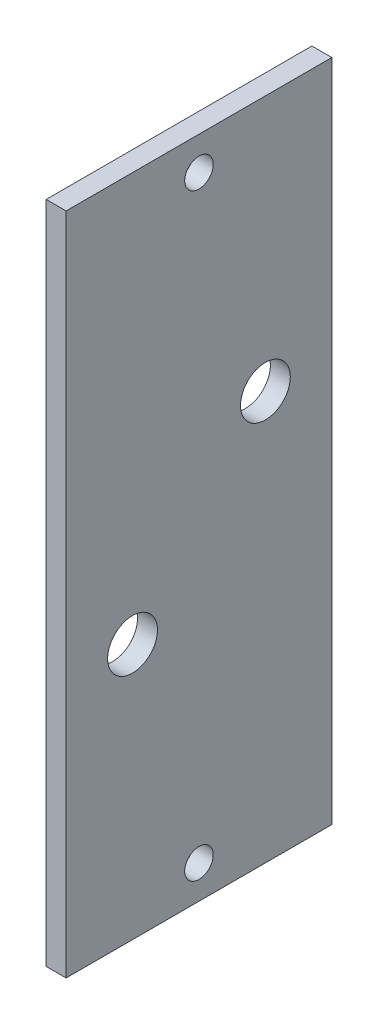
ISO-10303-21;
HEADER;
FILE_DESCRIPTION(('STEP AP214'),'2;1');
FILE_NAME('part.step','',(''),(''),'','','');
FILE_SCHEMA(('AUTOMOTIVE_DESIGN { 1 0 10303 214 1 1 1 1 }'));
ENDSEC;
DATA;
#1=APPLICATION_CONTEXT('core data for automotive mechanical design processes');
#2=APPLICATION_PROTOCOL_DEFINITION('international standard','automotive_design',2000,#1);
#3=PRODUCT_CONTEXT('',#1,'mechanical');
#4=PRODUCT('Part','Part','',(#3));
#5=PRODUCT_RELATED_PRODUCT_CATEGORY('part','',(#4));
#6=PRODUCT_DEFINITION_FORMATION('','',#4);
#7=PRODUCT_DEFINITION_CONTEXT('part definition',#1,'design');
#8=PRODUCT_DEFINITION('design','',#6,#7);
#9=PRODUCT_DEFINITION_SHAPE('','',#8);
#10=(LENGTH_UNIT() NAMED_UNIT(*) SI_UNIT(.MILLI.,.METRE.));
#11=(NAMED_UNIT(*) PLANE_ANGLE_UNIT() SI_UNIT($,.RADIAN.));
#12=(NAMED_UNIT(*) SI_UNIT($,.STERADIAN.) SOLID_ANGLE_UNIT());
#13=UNCERTAINTY_MEASURE_WITH_UNIT(LENGTH_MEASURE(1.E-05),#10,'distance_accuracy_value','');
#14=(GEOMETRIC_REPRESENTATION_CONTEXT(3) GLOBAL_UNCERTAINTY_ASSIGNED_CONTEXT((#13)) GLOBAL_UNIT_ASSIGNED_CONTEXT((#10,
#11,#12)) REPRESENTATION_CONTEXT('',''));
#15=CARTESIAN_POINT('',(0.,0.,0.));
#16=DIRECTION('',(0.,0.,1.));
#17=DIRECTION('',(1.,0.,0.));
#18=AXIS2_PLACEMENT_3D('',#15,#16,#17);
#19=CARTESIAN_POINT('',(3.,0.,0.));
#20=DIRECTION('',(-1.,0.,0.));
#21=DIRECTION('',(0.,0.,1.));
#22=AXIS2_PLACEMENT_3D('',#19,#20,#21);
#23=PLANE('',#22);
#24=DIRECTION('',(0.,-1.,0.));
#25=VECTOR('',#24,1.);
#26=CARTESIAN_POINT('',(3.,0.,0.));
#27=LINE('',#26,#25);
#28=CARTESIAN_POINT('',(3.,100.,0.));
#29=VERTEX_POINT('',#28);
#30=CARTESIAN_POINT('',(3.,0.,0.));
#31=VERTEX_POINT('',#30);
#32=EDGE_CURVE('E96',#29,#31,#27,.T.);
#33=ORIENTED_EDGE('',*,*,#32,.T.);
#34=DIRECTION('',(0.,0.,-1.));
#35=VECTOR('',#34,1.);
#36=CARTESIAN_POINT('',(3.,0.,0.));
#37=LINE('',#36,#35);
#38=CARTESIAN_POINT('',(3.,0.,-40.));
#39=VERTEX_POINT('',#38);
#40=EDGE_CURVE('E91',#31,#39,#37,.T.);
#41=ORIENTED_EDGE('',*,*,#40,.T.);
#42=DIRECTION('',(0.,1.,0.));
#43=VECTOR('',#42,1.);
#44=CARTESIAN_POINT('',(3.,0.,-40.));
#45=LINE('',#44,#43);
#46=CARTESIAN_POINT('',(3.,100.,-40.));
#47=VERTEX_POINT('',#46);
#48=EDGE_CURVE('E94',#39,#47,#45,.T.);
#49=ORIENTED_EDGE('',*,*,#48,.T.);
#50=DIRECTION('',(0.,0.,1.));
#51=VECTOR('',#50,1.);
#52=CARTESIAN_POINT('',(3.,100.,0.));
#53=LINE('',#52,#51);
#54=EDGE_CURVE('E61',#47,#29,#53,.T.);
#55=ORIENTED_EDGE('',*,*,#54,.T.);
#56=EDGE_LOOP('',(#33,#41,#49,#55));
#57=FACE_BOUND('',#56,.T.);
#58=CARTESIAN_POINT('',(3.,95.,-20.));
#59=DIRECTION('',(1.,0.,0.));
#60=DIRECTION('',(0.,0.,-1.));
#61=AXIS2_PLACEMENT_3D('',#58,#59,#60);
#62=CIRCLE('',#61,2.15);
#63=CARTESIAN_POINT('',(3.,95.,-22.15));
#64=VERTEX_POINT('',#63);
#65=EDGE_CURVE('E116',#64,#64,#62,.T.);
#66=ORIENTED_EDGE('',*,*,#65,.F.);
#67=EDGE_LOOP('',(#66));
#68=FACE_BOUND('',#67,.T.);
#69=CARTESIAN_POINT('',(3.,5.,-20.));
#70=DIRECTION('',(1.,0.,0.));
#71=DIRECTION('',(0.,0.,-1.));
#72=AXIS2_PLACEMENT_3D('',#69,#70,#71);
#73=CIRCLE('',#72,2.15);
#74=CARTESIAN_POINT('',(3.,5.,-22.15));
#75=VERTEX_POINT('',#74);
#76=EDGE_CURVE('E138',#75,#75,#73,.T.);
#77=ORIENTED_EDGE('',*,*,#76,.F.);
#78=EDGE_LOOP('',(#77));
#79=FACE_BOUND('',#78,.T.);
#80=CARTESIAN_POINT('',(3.,38.5,-10.));
#81=DIRECTION('',(1.,0.,0.));
#82=DIRECTION('',(0.,0.,-1.));
#83=AXIS2_PLACEMENT_3D('',#80,#81,#82);
#84=CIRCLE('',#83,3.75);
#85=CARTESIAN_POINT('',(3.,38.5,-13.75));
#86=VERTEX_POINT('',#85);
#87=EDGE_CURVE('E146',#86,#86,#84,.T.);
#88=ORIENTED_EDGE('',*,*,#87,.F.);
#89=EDGE_LOOP('',(#88));
#90=FACE_BOUND('',#89,.T.);
#91=CARTESIAN_POINT('',(3.,61.5,-30.));
#92=DIRECTION('',(1.,0.,0.));
#93=DIRECTION('',(0.,0.,-1.));
#94=AXIS2_PLACEMENT_3D('',#91,#92,#93);
#95=CIRCLE('',#94,3.75000000000001);
#96=CARTESIAN_POINT('',(3.,61.5,-33.75));
#97=VERTEX_POINT('',#96);
#98=EDGE_CURVE('E154',#97,#97,#95,.T.);
#99=ORIENTED_EDGE('',*,*,#98,.F.);
#100=EDGE_LOOP('',(#99));
#101=FACE_BOUND('',#100,.T.);
#102=ADVANCED_FACE('F43',(#57,#68,#79,#90,#101),#23,.F.);
#103=CARTESIAN_POINT('',(0.,0.,0.));
#104=DIRECTION('',(-1.,0.,0.));
#105=DIRECTION('',(0.,0.,1.));
#106=AXIS2_PLACEMENT_3D('',#103,#104,#105);
#107=PLANE('',#106);
#108=CARTESIAN_POINT('',(0.,38.5,-10.));
#109=DIRECTION('',(1.,0.,0.));
#110=DIRECTION('',(0.,0.,-1.));
#111=AXIS2_PLACEMENT_3D('',#108,#109,#110);
#112=CIRCLE('',#111,3.75);
#113=CARTESIAN_POINT('',(0.,38.5,-13.75));
#114=VERTEX_POINT('',#113);
#115=EDGE_CURVE('E150',#114,#114,#112,.T.);
#116=ORIENTED_EDGE('',*,*,#115,.T.);
#117=EDGE_LOOP('',(#116));
#118=FACE_BOUND('',#117,.T.);
#119=CARTESIAN_POINT('',(0.,95.,-20.));
#120=DIRECTION('',(1.,0.,0.));
#121=DIRECTION('',(0.,0.,-1.));
#122=AXIS2_PLACEMENT_3D('',#119,#120,#121);
#123=CIRCLE('',#122,2.15);
#124=CARTESIAN_POINT('',(0.,95.,-22.15));
#125=VERTEX_POINT('',#124);
#126=EDGE_CURVE('E134',#125,#125,#123,.T.);
#127=ORIENTED_EDGE('',*,*,#126,.T.);
#128=EDGE_LOOP('',(#127));
#129=FACE_BOUND('',#128,.T.);
#130=DIRECTION('',(0.,-1.,0.));
#131=VECTOR('',#130,1.);
#132=CARTESIAN_POINT('',(0.,0.,0.));
#133=LINE('',#132,#131);
#134=CARTESIAN_POINT('',(0.,100.,0.));
#135=VERTEX_POINT('',#134);
#136=CARTESIAN_POINT('',(0.,0.,0.));
#137=VERTEX_POINT('',#136);
#138=EDGE_CURVE('E112',#135,#137,#133,.T.);
#139=ORIENTED_EDGE('',*,*,#138,.F.);
#140=DIRECTION('',(0.,0.,1.));
#141=VECTOR('',#140,1.);
#142=CARTESIAN_POINT('',(0.,100.,0.));
#143=LINE('',#142,#141);
#144=CARTESIAN_POINT('',(0.,100.,-40.));
#145=VERTEX_POINT('',#144);
#146=EDGE_CURVE('E84',#145,#135,#143,.T.);
#147=ORIENTED_EDGE('',*,*,#146,.F.);
#148=DIRECTION('',(0.,1.,0.));
#149=VECTOR('',#148,1.);
#150=CARTESIAN_POINT('',(0.,0.,-40.));
#151=LINE('',#150,#149);
#152=CARTESIAN_POINT('',(0.,0.,-40.));
#153=VERTEX_POINT('',#152);
#154=EDGE_CURVE('E78',#153,#145,#151,.T.);
#155=ORIENTED_EDGE('',*,*,#154,.F.);
#156=DIRECTION('',(0.,0.,-1.));
#157=VECTOR('',#156,1.);
#158=CARTESIAN_POINT('',(0.,0.,0.));
#159=LINE('',#158,#157);
#160=EDGE_CURVE('E101',#137,#153,#159,.T.);
#161=ORIENTED_EDGE('',*,*,#160,.F.);
#162=EDGE_LOOP('',(#139,#147,#155,#161));
#163=FACE_BOUND('',#162,.T.);
#164=CARTESIAN_POINT('',(0.,5.,-20.));
#165=DIRECTION('',(1.,0.,0.));
#166=DIRECTION('',(0.,0.,-1.));
#167=AXIS2_PLACEMENT_3D('',#164,#165,#166);
#168=CIRCLE('',#167,2.15);
#169=CARTESIAN_POINT('',(0.,5.,-22.15));
#170=VERTEX_POINT('',#169);
#171=EDGE_CURVE('E142',#170,#170,#168,.T.);
#172=ORIENTED_EDGE('',*,*,#171,.T.);
#173=EDGE_LOOP('',(#172));
#174=FACE_BOUND('',#173,.T.);
#175=CARTESIAN_POINT('',(0.,61.5,-30.));
#176=DIRECTION('',(1.,0.,0.));
#177=DIRECTION('',(0.,0.,-1.));
#178=AXIS2_PLACEMENT_3D('',#175,#176,#177);
#179=CIRCLE('',#178,3.75000000000001);
#180=CARTESIAN_POINT('',(0.,61.5,-33.75));
#181=VERTEX_POINT('',#180);
#182=EDGE_CURVE('E158',#181,#181,#179,.T.);
#183=ORIENTED_EDGE('',*,*,#182,.T.);
#184=EDGE_LOOP('',(#183));
#185=FACE_BOUND('',#184,.T.);
#186=ADVANCED_FACE('F129',(#118,#129,#163,#174,#185),#107,.T.);
#187=CARTESIAN_POINT('',(3.,0.,0.));
#188=DIRECTION('',(0.,0.,-1.));
#189=DIRECTION('',(-1.,0.,0.));
#190=AXIS2_PLACEMENT_3D('',#187,#188,#189);
#191=PLANE('',#190);
#192=ORIENTED_EDGE('',*,*,#138,.T.);
#193=DIRECTION('',(-1.,0.,0.));
#194=VECTOR('',#193,1.);
#195=CARTESIAN_POINT('',(3.,0.,0.));
#196=LINE('',#195,#194);
#197=EDGE_CURVE('E11',#31,#137,#196,.T.);
#198=ORIENTED_EDGE('',*,*,#197,.F.);
#199=ORIENTED_EDGE('',*,*,#32,.F.);
#200=DIRECTION('',(-1.,0.,0.));
#201=VECTOR('',#200,1.);
#202=CARTESIAN_POINT('',(3.,100.,0.));
#203=LINE('',#202,#201);
#204=EDGE_CURVE('E108',#29,#135,#203,.T.);
#205=ORIENTED_EDGE('',*,*,#204,.T.);
#206=EDGE_LOOP('',(#192,#198,#199,#205));
#207=FACE_BOUND('',#206,.T.);
#208=ADVANCED_FACE('F45',(#207),#191,.F.);
#209=CARTESIAN_POINT('',(3.,0.,0.));
#210=DIRECTION('',(0.,1.,0.));
#211=DIRECTION('',(0.,0.,1.));
#212=AXIS2_PLACEMENT_3D('',#209,#210,#211);
#213=PLANE('',#212);
#214=ORIENTED_EDGE('',*,*,#160,.T.);
#215=DIRECTION('',(-1.,0.,0.));
#216=VECTOR('',#215,1.);
#217=CARTESIAN_POINT('',(3.,0.,-40.));
#218=LINE('',#217,#216);
#219=EDGE_CURVE('E53',#39,#153,#218,.T.);
#220=ORIENTED_EDGE('',*,*,#219,.F.);
#221=ORIENTED_EDGE('',*,*,#40,.F.);
#222=ORIENTED_EDGE('',*,*,#197,.T.);
#223=EDGE_LOOP('',(#214,#220,#221,#222));
#224=FACE_BOUND('',#223,.T.);
#225=ADVANCED_FACE('F100',(#224),#213,.F.);
#226=CARTESIAN_POINT('',(3.,0.,-40.));
#227=DIRECTION('',(0.,0.,1.));
#228=DIRECTION('',(1.,0.,0.));
#229=AXIS2_PLACEMENT_3D('',#226,#227,#228);
#230=PLANE('',#229);
#231=ORIENTED_EDGE('',*,*,#154,.T.);
#232=DIRECTION('',(-1.,0.,0.));
#233=VECTOR('',#232,1.);
#234=CARTESIAN_POINT('',(3.,100.,-40.));
#235=LINE('',#234,#233);
#236=EDGE_CURVE('E103',#47,#145,#235,.T.);
#237=ORIENTED_EDGE('',*,*,#236,.F.);
#238=ORIENTED_EDGE('',*,*,#48,.F.);
#239=ORIENTED_EDGE('',*,*,#219,.T.);
#240=EDGE_LOOP('',(#231,#237,#238,#239));
#241=FACE_BOUND('',#240,.T.);
#242=ADVANCED_FACE('F104',(#241),#230,.F.);
#243=CARTESIAN_POINT('',(3.,100.,0.));
#244=DIRECTION('',(0.,-1.,0.));
#245=DIRECTION('',(0.,0.,-1.));
#246=AXIS2_PLACEMENT_3D('',#243,#244,#245);
#247=PLANE('',#246);
#248=ORIENTED_EDGE('',*,*,#146,.T.);
#249=ORIENTED_EDGE('',*,*,#204,.F.);
#250=ORIENTED_EDGE('',*,*,#54,.F.);
#251=ORIENTED_EDGE('',*,*,#236,.T.);
#252=EDGE_LOOP('',(#248,#249,#250,#251));
#253=FACE_BOUND('',#252,.T.);
#254=ADVANCED_FACE('F126',(#253),#247,.F.);
#255=CARTESIAN_POINT('',(3.,95.,-20.));
#256=DIRECTION('',(-1.,0.,0.));
#257=DIRECTION('',(0.,0.,1.));
#258=AXIS2_PLACEMENT_3D('',#255,#256,#257);
#259=CYLINDRICAL_SURFACE('',#258,2.15);
#260=ORIENTED_EDGE('',*,*,#65,.T.);
#261=EDGE_LOOP('',(#260));
#262=FACE_BOUND('',#261,.T.);
#263=ORIENTED_EDGE('',*,*,#126,.F.);
#264=EDGE_LOOP('',(#263));
#265=FACE_BOUND('',#264,.T.);
#266=ADVANCED_FACE('F177',(#262,#265),#259,.F.);
#267=CARTESIAN_POINT('',(3.,5.,-20.));
#268=DIRECTION('',(-1.,0.,0.));
#269=DIRECTION('',(0.,0.,1.));
#270=AXIS2_PLACEMENT_3D('',#267,#268,#269);
#271=CYLINDRICAL_SURFACE('',#270,2.15);
#272=ORIENTED_EDGE('',*,*,#76,.T.);
#273=EDGE_LOOP('',(#272));
#274=FACE_BOUND('',#273,.T.);
#275=ORIENTED_EDGE('',*,*,#171,.F.);
#276=EDGE_LOOP('',(#275));
#277=FACE_BOUND('',#276,.T.);
#278=ADVANCED_FACE('F231',(#274,#277),#271,.F.);
#279=CARTESIAN_POINT('',(3.,38.5,-10.));
#280=DIRECTION('',(-1.,0.,0.));
#281=DIRECTION('',(0.,0.,1.));
#282=AXIS2_PLACEMENT_3D('',#279,#280,#281);
#283=CYLINDRICAL_SURFACE('',#282,3.75);
#284=ORIENTED_EDGE('',*,*,#87,.T.);
#285=EDGE_LOOP('',(#284));
#286=FACE_BOUND('',#285,.T.);
#287=ORIENTED_EDGE('',*,*,#115,.F.);
#288=EDGE_LOOP('',(#287));
#289=FACE_BOUND('',#288,.T.);
#290=ADVANCED_FACE('F240',(#286,#289),#283,.F.);
#291=CARTESIAN_POINT('',(3.,61.5,-30.));
#292=DIRECTION('',(-1.,0.,0.));
#293=DIRECTION('',(0.,0.,1.));
#294=AXIS2_PLACEMENT_3D('',#291,#292,#293);
#295=CYLINDRICAL_SURFACE('',#294,3.75000000000001);
#296=ORIENTED_EDGE('',*,*,#98,.T.);
#297=EDGE_LOOP('',(#296));
#298=FACE_BOUND('',#297,.T.);
#299=ORIENTED_EDGE('',*,*,#182,.F.);
#300=EDGE_LOOP('',(#299));
#301=FACE_BOUND('',#300,.T.);
#302=ADVANCED_FACE('F166',(#298,#301),#295,.F.);
#303=CLOSED_SHELL('',(#102,#186,#208,#225,#242,#254,#266,#278,#290,#302));
#304=MANIFOLD_SOLID_BREP('B2',#303);
#305=ADVANCED_BREP_SHAPE_REPRESENTATION('',(#18,#304),#14);
#306=SHAPE_DEFINITION_REPRESENTATION(#9,#305);
ENDSEC;
END-ISO-10303-21;
